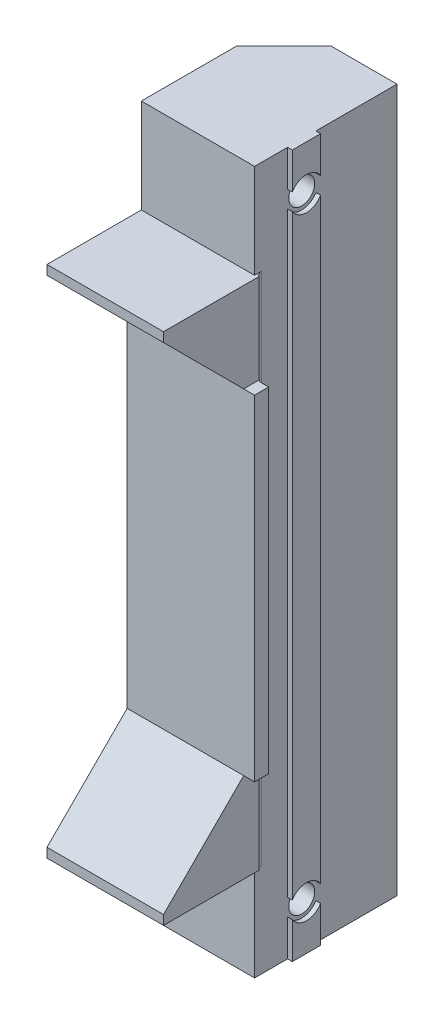
ISO-10303-21;
HEADER;
FILE_DESCRIPTION(('STEP AP214'),'2;1');
FILE_NAME('part.step','',(''),(''),'','','');
FILE_SCHEMA(('AUTOMOTIVE_DESIGN { 1 0 10303 214 1 1 1 1 }'));
ENDSEC;
DATA;
#1=APPLICATION_CONTEXT('core data for automotive mechanical design processes');
#2=APPLICATION_PROTOCOL_DEFINITION('international standard','automotive_design',2000,#1);
#3=PRODUCT_CONTEXT('',#1,'mechanical');
#4=PRODUCT('Part','Part','',(#3));
#5=PRODUCT_RELATED_PRODUCT_CATEGORY('part','',(#4));
#6=PRODUCT_DEFINITION_FORMATION('','',#4);
#7=PRODUCT_DEFINITION_CONTEXT('part definition',#1,'design');
#8=PRODUCT_DEFINITION('design','',#6,#7);
#9=PRODUCT_DEFINITION_SHAPE('','',#8);
#10=(LENGTH_UNIT() NAMED_UNIT(*) SI_UNIT(.MILLI.,.METRE.));
#11=(NAMED_UNIT(*) PLANE_ANGLE_UNIT() SI_UNIT($,.RADIAN.));
#12=(NAMED_UNIT(*) SI_UNIT($,.STERADIAN.) SOLID_ANGLE_UNIT());
#13=UNCERTAINTY_MEASURE_WITH_UNIT(LENGTH_MEASURE(1.E-05),#10,'distance_accuracy_value','');
#14=(GEOMETRIC_REPRESENTATION_CONTEXT(3) GLOBAL_UNCERTAINTY_ASSIGNED_CONTEXT((#13)) GLOBAL_UNIT_ASSIGNED_CONTEXT((#10,
#11,#12)) REPRESENTATION_CONTEXT('',''));
#15=CARTESIAN_POINT('',(0.,0.,0.));
#16=DIRECTION('',(0.,0.,1.));
#17=DIRECTION('',(1.,0.,0.));
#18=AXIS2_PLACEMENT_3D('',#15,#16,#17);
#19=CARTESIAN_POINT('',(-71.75,-84.6006992921502,30.2));
#20=DIRECTION('',(1.,0.,0.));
#21=DIRECTION('',(0.,-1.,0.));
#22=AXIS2_PLACEMENT_3D('',#19,#20,#21);
#23=PLANE('',#22);
#24=DIRECTION('',(0.,1.,0.));
#25=VECTOR('',#24,1.);
#26=CARTESIAN_POINT('',(-71.75,-84.6006992921502,30.2));
#27=LINE('',#26,#25);
#28=CARTESIAN_POINT('',(-71.75,-123.,30.2));
#29=VERTEX_POINT('',#28);
#30=CARTESIAN_POINT('',(-71.75,-52.,30.2));
#31=VERTEX_POINT('',#30);
#32=EDGE_CURVE('E261',#29,#31,#27,.T.);
#33=ORIENTED_EDGE('',*,*,#32,.T.);
#34=DIRECTION('',(0.,0.,1.));
#35=VECTOR('',#34,1.);
#36=CARTESIAN_POINT('',(-71.75,-52.,0.));
#37=LINE('',#36,#35);
#38=CARTESIAN_POINT('',(-71.75,-52.,33.2));
#39=VERTEX_POINT('',#38);
#40=EDGE_CURVE('E256',#31,#39,#37,.T.);
#41=ORIENTED_EDGE('',*,*,#40,.T.);
#42=DIRECTION('',(0.,1.,0.));
#43=VECTOR('',#42,1.);
#44=CARTESIAN_POINT('',(-71.75,-84.6006992921502,33.2));
#45=LINE('',#44,#43);
#46=CARTESIAN_POINT('',(-71.75,-123.,33.2));
#47=VERTEX_POINT('',#46);
#48=EDGE_CURVE('E251',#47,#39,#45,.T.);
#49=ORIENTED_EDGE('',*,*,#48,.F.);
#50=DIRECTION('',(0.,0.,1.));
#51=VECTOR('',#50,1.);
#52=CARTESIAN_POINT('',(-71.75,-123.,0.));
#53=LINE('',#52,#51);
#54=EDGE_CURVE('E255',#29,#47,#53,.T.);
#55=ORIENTED_EDGE('',*,*,#54,.F.);
#56=EDGE_LOOP('',(#33,#41,#49,#55));
#57=FACE_BOUND('',#56,.T.);
#58=ADVANCED_FACE('F46',(#57),#23,.T.);
#59=CARTESIAN_POINT('',(-74.75,-84.6006992921502,30.2));
#60=DIRECTION('',(0.,0.,-1.));
#61=DIRECTION('',(-1.,0.,0.));
#62=AXIS2_PLACEMENT_3D('',#59,#60,#61);
#63=PLANE('',#62);
#64=DIRECTION('',(0.,1.,0.));
#65=VECTOR('',#64,1.);
#66=CARTESIAN_POINT('',(-73.25,-56.,30.2));
#67=LINE('',#66,#65);
#68=CARTESIAN_POINT('',(-73.25,-52.,30.2));
#69=VERTEX_POINT('',#68);
#70=CARTESIAN_POINT('',(-73.25,-123.,30.2));
#71=VERTEX_POINT('',#70);
#72=EDGE_CURVE('E588',#69,#71,#67,.F.);
#73=ORIENTED_EDGE('',*,*,#72,.F.);
#74=DIRECTION('',(1.,0.,0.));
#75=VECTOR('',#74,1.);
#76=CARTESIAN_POINT('',(-74.75,-52.,30.2));
#77=LINE('',#76,#75);
#78=EDGE_CURVE('E459',#69,#31,#77,.T.);
#79=ORIENTED_EDGE('',*,*,#78,.T.);
#80=ORIENTED_EDGE('',*,*,#32,.F.);
#81=DIRECTION('',(1.,0.,0.));
#82=VECTOR('',#81,1.);
#83=CARTESIAN_POINT('',(-74.75,-123.,30.2));
#84=LINE('',#83,#82);
#85=EDGE_CURVE('E277',#71,#29,#84,.T.);
#86=ORIENTED_EDGE('',*,*,#85,.F.);
#87=EDGE_LOOP('',(#73,#79,#80,#86));
#88=FACE_BOUND('',#87,.T.);
#89=ADVANCED_FACE('F689',(#88),#63,.T.);
#90=CARTESIAN_POINT('',(-71.75,-84.6006992921502,33.2));
#91=DIRECTION('',(0.,0.,1.));
#92=DIRECTION('',(1.,0.,0.));
#93=AXIS2_PLACEMENT_3D('',#90,#91,#92);
#94=PLANE('',#93);
#95=ORIENTED_EDGE('',*,*,#48,.T.);
#96=DIRECTION('',(-1.,0.,0.));
#97=VECTOR('',#96,1.);
#98=CARTESIAN_POINT('',(-46.254902432036,-52.,33.2));
#99=LINE('',#98,#97);
#100=CARTESIAN_POINT('',(-74.05,-52.,33.2));
#101=VERTEX_POINT('',#100);
#102=EDGE_CURVE('E490',#39,#101,#99,.T.);
#103=ORIENTED_EDGE('',*,*,#102,.T.);
#104=DIRECTION('',(1.,0.,0.));
#105=VECTOR('',#104,1.);
#106=CARTESIAN_POINT('',(-98.75,-52.,33.2));
#107=LINE('',#106,#105);
#108=CARTESIAN_POINT('',(-98.75,-52.,33.2));
#109=VERTEX_POINT('',#108);
#110=EDGE_CURVE('E487',#109,#101,#107,.T.);
#111=ORIENTED_EDGE('',*,*,#110,.F.);
#112=DIRECTION('',(0.,1.,0.));
#113=VECTOR('',#112,1.);
#114=CARTESIAN_POINT('',(-98.75,-90.673332692431,33.2));
#115=LINE('',#114,#113);
#116=CARTESIAN_POINT('',(-98.75,-123.,33.2));
#117=VERTEX_POINT('',#116);
#118=EDGE_CURVE('E433',#117,#109,#115,.T.);
#119=ORIENTED_EDGE('',*,*,#118,.F.);
#120=DIRECTION('',(1.,0.,0.));
#121=VECTOR('',#120,1.);
#122=CARTESIAN_POINT('',(-98.75,-123.,33.2));
#123=LINE('',#122,#121);
#124=CARTESIAN_POINT('',(-74.05,-123.,33.2));
#125=VERTEX_POINT('',#124);
#126=EDGE_CURVE('E268',#117,#125,#123,.T.);
#127=ORIENTED_EDGE('',*,*,#126,.T.);
#128=DIRECTION('',(-1.,0.,0.));
#129=VECTOR('',#128,1.);
#130=CARTESIAN_POINT('',(-46.254902432036,-123.,33.2));
#131=LINE('',#130,#129);
#132=EDGE_CURVE('E265',#47,#125,#131,.T.);
#133=ORIENTED_EDGE('',*,*,#132,.F.);
#134=EDGE_LOOP('',(#95,#103,#111,#119,#127,#133));
#135=FACE_BOUND('',#134,.T.);
#136=ADVANCED_FACE('F266',(#135),#94,.T.);
#137=CARTESIAN_POINT('',(-73.25,-84.6006992921502,28.7));
#138=DIRECTION('',(0.,-1.,0.));
#139=DIRECTION('',(-1.,0.,0.));
#140=AXIS2_PLACEMENT_3D('',#137,#138,#139);
#141=CYLINDRICAL_SURFACE('',#140,1.5);
#142=CARTESIAN_POINT('',(-73.25,-33.,28.7));
#143=DIRECTION('',(0.,1.,0.));
#144=DIRECTION('',(0.,0.,1.));
#145=AXIS2_PLACEMENT_3D('',#142,#143,#144);
#146=CIRCLE('',#145,1.5);
#147=CARTESIAN_POINT('',(-74.05,-33.,29.968857754045));
#148=VERTEX_POINT('',#147);
#149=CARTESIAN_POINT('',(-74.75,-33.,28.7));
#150=VERTEX_POINT('',#149);
#151=EDGE_CURVE('E595',#148,#150,#146,.F.);
#152=ORIENTED_EDGE('',*,*,#151,.F.);
#153=DIRECTION('',(0.,-1.,0.));
#154=VECTOR('',#153,1.);
#155=CARTESIAN_POINT('',(-74.05,-84.6006992921502,29.968857754045));
#156=LINE('',#155,#154);
#157=CARTESIAN_POINT('',(-74.05,-52.,29.968857754045));
#158=VERTEX_POINT('',#157);
#159=EDGE_CURVE('E440',#148,#158,#156,.T.);
#160=ORIENTED_EDGE('',*,*,#159,.T.);
#161=CARTESIAN_POINT('',(-73.25,-52.,28.7));
#162=DIRECTION('',(0.,1.,0.));
#163=DIRECTION('',(-1.,0.,0.));
#164=AXIS2_PLACEMENT_3D('',#161,#162,#163);
#165=CIRCLE('',#164,1.5);
#166=EDGE_CURVE('E456',#69,#158,#165,.F.);
#167=ORIENTED_EDGE('',*,*,#166,.F.);
#168=ORIENTED_EDGE('',*,*,#72,.T.);
#169=CARTESIAN_POINT('',(-73.25,-123.,28.7));
#170=DIRECTION('',(0.,1.,0.));
#171=DIRECTION('',(-1.,0.,0.));
#172=AXIS2_PLACEMENT_3D('',#169,#170,#171);
#173=CIRCLE('',#172,1.5);
#174=CARTESIAN_POINT('',(-74.05,-123.,29.968857754045));
#175=VERTEX_POINT('',#174);
#176=EDGE_CURVE('E285',#71,#175,#173,.F.);
#177=ORIENTED_EDGE('',*,*,#176,.T.);
#178=DIRECTION('',(0.,1.,0.));
#179=VECTOR('',#178,1.);
#180=CARTESIAN_POINT('',(-74.05,-90.3993007078498,29.968857754045));
#181=LINE('',#180,#179);
#182=CARTESIAN_POINT('',(-74.05,-142.,29.968857754045));
#183=VERTEX_POINT('',#182);
#184=EDGE_CURVE('E279',#183,#175,#181,.T.);
#185=ORIENTED_EDGE('',*,*,#184,.F.);
#186=CARTESIAN_POINT('',(-73.25,-142.,28.7));
#187=DIRECTION('',(0.,1.,0.));
#188=DIRECTION('',(0.,0.,1.));
#189=AXIS2_PLACEMENT_3D('',#186,#187,#188);
#190=CIRCLE('',#189,1.5);
#191=CARTESIAN_POINT('',(-74.75,-142.,28.7));
#192=VERTEX_POINT('',#191);
#193=EDGE_CURVE('E422',#183,#192,#190,.F.);
#194=ORIENTED_EDGE('',*,*,#193,.T.);
#195=DIRECTION('',(0.,1.,0.));
#196=VECTOR('',#195,1.);
#197=CARTESIAN_POINT('',(-74.75,-13.,28.7));
#198=LINE('',#197,#196);
#199=EDGE_CURVE('E584',#192,#150,#198,.T.);
#200=ORIENTED_EDGE('',*,*,#199,.T.);
#201=EDGE_LOOP('',(#152,#160,#167,#168,#177,#185,#194,#200));
#202=FACE_BOUND('',#201,.T.);
#203=ADVANCED_FACE('F684',(#202),#141,.F.);
#204=CARTESIAN_POINT('',(-74.75,-84.6006992921502,23.2));
#205=DIRECTION('',(0.,0.,1.));
#206=DIRECTION('',(1.,0.,0.));
#207=AXIS2_PLACEMENT_3D('',#204,#205,#206);
#208=PLANE('',#207);
#209=DIRECTION('',(-1.,0.,0.));
#210=VECTOR('',#209,1.);
#211=CARTESIAN_POINT('',(84.6494949366116,-24.302775637732,23.2));
#212=LINE('',#211,#210);
#213=CARTESIAN_POINT('',(-73.75,-24.3027756377326,23.2));
#214=VERTEX_POINT('',#213);
#215=CARTESIAN_POINT('',(-74.75,-24.3027756377326,23.2));
#216=VERTEX_POINT('',#215);
#217=EDGE_CURVE('E527',#214,#216,#212,.T.);
#218=ORIENTED_EDGE('',*,*,#217,.T.);
#219=DIRECTION('',(0.,1.,0.));
#220=VECTOR('',#219,1.);
#221=CARTESIAN_POINT('',(-74.75,-84.6006992921502,23.2));
#222=LINE('',#221,#220);
#223=CARTESIAN_POINT('',(-74.75,-150.697224362267,23.2));
#224=VERTEX_POINT('',#223);
#225=EDGE_CURVE('E562',#224,#216,#222,.T.);
#226=ORIENTED_EDGE('',*,*,#225,.F.);
#227=DIRECTION('',(-1.,0.,0.));
#228=VECTOR('',#227,1.);
#229=CARTESIAN_POINT('',(84.6494949366116,-150.697224362268,23.2));
#230=LINE('',#229,#228);
#231=CARTESIAN_POINT('',(-73.75,-150.697224362267,23.2));
#232=VERTEX_POINT('',#231);
#233=EDGE_CURVE('E365',#232,#224,#230,.T.);
#234=ORIENTED_EDGE('',*,*,#233,.F.);
#235=DIRECTION('',(0.,1.,0.));
#236=VECTOR('',#235,1.);
#237=CARTESIAN_POINT('',(-73.75,-84.6006992921502,23.2));
#238=LINE('',#237,#236);
#239=EDGE_CURVE('E566',#232,#214,#238,.T.);
#240=ORIENTED_EDGE('',*,*,#239,.T.);
#241=EDGE_LOOP('',(#218,#226,#234,#240));
#242=FACE_BOUND('',#241,.T.);
#243=ADVANCED_FACE('F731',(#242),#208,.T.);
#244=CARTESIAN_POINT('',(-73.75,-84.6006992921502,17.2));
#245=DIRECTION('',(1.,0.,0.));
#246=DIRECTION('',(0.,-1.,0.));
#247=AXIS2_PLACEMENT_3D('',#244,#245,#246);
#248=PLANE('',#247);
#249=CARTESIAN_POINT('',(-73.75,-22.5,20.2000000000004));
#250=DIRECTION('',(-1.,0.,0.));
#251=DIRECTION('',(0.,-1.,0.));
#252=AXIS2_PLACEMENT_3D('',#249,#250,#251);
#253=CIRCLE('',#252,3.5);
#254=CARTESIAN_POINT('',(-73.75,-20.6972243622674,23.2));
#255=VERTEX_POINT('',#254);
#256=CARTESIAN_POINT('',(-73.75,-20.697224362268,17.2000000000004));
#257=VERTEX_POINT('',#256);
#258=EDGE_CURVE('E528',#255,#257,#253,.T.);
#259=ORIENTED_EDGE('',*,*,#258,.T.);
#260=DIRECTION('',(0.,1.,0.));
#261=VECTOR('',#260,1.);
#262=CARTESIAN_POINT('',(-73.75,-84.6006992921502,17.2));
#263=LINE('',#262,#261);
#264=CARTESIAN_POINT('',(-73.75,-13.,17.2));
#265=VERTEX_POINT('',#264);
#266=EDGE_CURVE('E573',#257,#265,#263,.T.);
#267=ORIENTED_EDGE('',*,*,#266,.T.);
#268=DIRECTION('',(0.,0.,1.));
#269=VECTOR('',#268,1.);
#270=CARTESIAN_POINT('',(-73.75,-13.,17.2));
#271=LINE('',#270,#269);
#272=CARTESIAN_POINT('',(-73.75,-13.,23.2));
#273=VERTEX_POINT('',#272);
#274=EDGE_CURVE('E549',#265,#273,#271,.T.);
#275=ORIENTED_EDGE('',*,*,#274,.T.);
#276=EDGE_CURVE('E569',#255,#273,#238,.T.);
#277=ORIENTED_EDGE('',*,*,#276,.F.);
#278=EDGE_LOOP('',(#259,#267,#275,#277));
#279=FACE_BOUND('',#278,.T.);
#280=ADVANCED_FACE('F736',(#279),#248,.T.);
#281=CARTESIAN_POINT('',(-74.75,-84.6006992921502,17.2));
#282=DIRECTION('',(0.,0.,-1.));
#283=DIRECTION('',(-1.,0.,0.));
#284=AXIS2_PLACEMENT_3D('',#281,#282,#283);
#285=PLANE('',#284);
#286=DIRECTION('',(-1.,0.,0.));
#287=VECTOR('',#286,1.);
#288=CARTESIAN_POINT('',(84.6494949366116,-20.697224362268,17.2));
#289=LINE('',#288,#287);
#290=CARTESIAN_POINT('',(-74.75,-20.6972243622686,17.2));
#291=VERTEX_POINT('',#290);
#292=EDGE_CURVE('E532',#257,#291,#289,.T.);
#293=ORIENTED_EDGE('',*,*,#292,.T.);
#294=DIRECTION('',(0.,1.,0.));
#295=VECTOR('',#294,1.);
#296=CARTESIAN_POINT('',(-74.75,-84.6006992921502,17.2));
#297=LINE('',#296,#295);
#298=CARTESIAN_POINT('',(-74.75,-13.,17.2));
#299=VERTEX_POINT('',#298);
#300=EDGE_CURVE('E558',#291,#299,#297,.T.);
#301=ORIENTED_EDGE('',*,*,#300,.T.);
#302=DIRECTION('',(1.,0.,0.));
#303=VECTOR('',#302,1.);
#304=CARTESIAN_POINT('',(-74.75,-13.,17.2));
#305=LINE('',#304,#303);
#306=EDGE_CURVE('E546',#299,#265,#305,.T.);
#307=ORIENTED_EDGE('',*,*,#306,.T.);
#308=ORIENTED_EDGE('',*,*,#266,.F.);
#309=EDGE_LOOP('',(#293,#301,#307,#308));
#310=FACE_BOUND('',#309,.T.);
#311=ADVANCED_FACE('F741',(#310),#285,.T.);
#312=CARTESIAN_POINT('',(-88.75,-22.5,20.2));
#313=DIRECTION('',(1.,0.,0.));
#314=DIRECTION('',(0.,0.,-1.));
#315=AXIS2_PLACEMENT_3D('',#312,#313,#314);
#316=CYLINDRICAL_SURFACE('',#315,2.75);
#317=CARTESIAN_POINT('',(-83.75,-22.5,20.2));
#318=DIRECTION('',(-1.,0.,0.));
#319=DIRECTION('',(0.,0.,-1.));
#320=AXIS2_PLACEMENT_3D('',#317,#318,#319);
#321=CIRCLE('',#320,2.75);
#322=CARTESIAN_POINT('',(-83.75,-22.5,17.45));
#323=VERTEX_POINT('',#322);
#324=EDGE_CURVE('E591',#323,#323,#321,.F.);
#325=ORIENTED_EDGE('',*,*,#324,.F.);
#326=EDGE_LOOP('',(#325));
#327=FACE_BOUND('',#326,.T.);
#328=CARTESIAN_POINT('',(-74.75,-22.5,20.2));
#329=DIRECTION('',(-1.,0.,0.));
#330=DIRECTION('',(0.,-1.,0.));
#331=AXIS2_PLACEMENT_3D('',#328,#329,#330);
#332=CIRCLE('',#331,2.75);
#333=CARTESIAN_POINT('',(-74.75,-25.25,20.2));
#334=VERTEX_POINT('',#333);
#335=EDGE_CURVE('E523',#334,#334,#332,.F.);
#336=ORIENTED_EDGE('',*,*,#335,.T.);
#337=EDGE_LOOP('',(#336));
#338=FACE_BOUND('',#337,.T.);
#339=ADVANCED_FACE('F748',(#327,#338),#316,.F.);
#340=CARTESIAN_POINT('',(-74.75,-26.,7.2));
#341=DIRECTION('',(-1.,0.,0.));
#342=DIRECTION('',(0.,0.,1.));
#343=AXIS2_PLACEMENT_3D('',#340,#341,#342);
#344=PLANE('',#343);
#345=DIRECTION('',(0.,0.,1.));
#346=VECTOR('',#345,1.);
#347=CARTESIAN_POINT('',(-74.75,-162.,10.2));
#348=LINE('',#347,#346);
#349=CARTESIAN_POINT('',(-74.75,-162.,0.));
#350=VERTEX_POINT('',#349);
#351=CARTESIAN_POINT('',(-74.75,-162.,17.2));
#352=VERTEX_POINT('',#351);
#353=EDGE_CURVE('E381',#350,#352,#348,.T.);
#354=ORIENTED_EDGE('',*,*,#353,.F.);
#355=DIRECTION('',(0.,-1.,0.));
#356=VECTOR('',#355,1.);
#357=CARTESIAN_POINT('',(-74.75,-26.,0.));
#358=LINE('',#357,#356);
#359=CARTESIAN_POINT('',(-74.75,-13.,0.));
#360=VERTEX_POINT('',#359);
#361=EDGE_CURVE('E260',#360,#350,#358,.T.);
#362=ORIENTED_EDGE('',*,*,#361,.F.);
#363=DIRECTION('',(0.,0.,1.));
#364=VECTOR('',#363,1.);
#365=CARTESIAN_POINT('',(-74.75,-13.,10.2));
#366=LINE('',#365,#364);
#367=EDGE_CURVE('E543',#360,#299,#366,.T.);
#368=ORIENTED_EDGE('',*,*,#367,.T.);
#369=ORIENTED_EDGE('',*,*,#300,.F.);
#370=CARTESIAN_POINT('',(-74.75,-22.5,20.2000000000004));
#371=DIRECTION('',(-1.,0.,0.));
#372=DIRECTION('',(0.,-1.,0.));
#373=AXIS2_PLACEMENT_3D('',#370,#371,#372);
#374=CIRCLE('',#373,3.5);
#375=CARTESIAN_POINT('',(-74.75,-20.6972243622674,23.2));
#376=VERTEX_POINT('',#375);
#377=EDGE_CURVE('E517',#376,#291,#374,.T.);
#378=ORIENTED_EDGE('',*,*,#377,.F.);
#379=CARTESIAN_POINT('',(-74.75,-13.,23.2));
#380=VERTEX_POINT('',#379);
#381=EDGE_CURVE('E565',#376,#380,#222,.T.);
#382=ORIENTED_EDGE('',*,*,#381,.T.);
#383=DIRECTION('',(0.,0.,1.));
#384=VECTOR('',#383,1.);
#385=CARTESIAN_POINT('',(-74.75,-13.,23.2));
#386=LINE('',#385,#384);
#387=CARTESIAN_POINT('',(-74.75,-13.,30.2));
#388=VERTEX_POINT('',#387);
#389=EDGE_CURVE('E556',#380,#388,#386,.T.);
#390=ORIENTED_EDGE('',*,*,#389,.T.);
#391=DIRECTION('',(0.,1.,0.));
#392=VECTOR('',#391,1.);
#393=CARTESIAN_POINT('',(-74.75,-33.,30.2));
#394=LINE('',#393,#392);
#395=CARTESIAN_POINT('',(-74.75,-33.,30.2));
#396=VERTEX_POINT('',#395);
#397=EDGE_CURVE('E507',#396,#388,#394,.T.);
#398=ORIENTED_EDGE('',*,*,#397,.F.);
#399=DIRECTION('',(0.,0.,1.));
#400=VECTOR('',#399,1.);
#401=CARTESIAN_POINT('',(-74.75,-33.,30.2));
#402=LINE('',#401,#400);
#403=EDGE_CURVE('E500',#150,#396,#402,.T.);
#404=ORIENTED_EDGE('',*,*,#403,.F.);
#405=ORIENTED_EDGE('',*,*,#199,.F.);
#406=DIRECTION('',(0.,0.,1.));
#407=VECTOR('',#406,1.);
#408=CARTESIAN_POINT('',(-74.75,-142.,30.2));
#409=LINE('',#408,#407);
#410=CARTESIAN_POINT('',(-74.75,-142.,30.2));
#411=VERTEX_POINT('',#410);
#412=EDGE_CURVE('E336',#192,#411,#409,.T.);
#413=ORIENTED_EDGE('',*,*,#412,.T.);
#414=DIRECTION('',(0.,-1.,0.));
#415=VECTOR('',#414,1.);
#416=CARTESIAN_POINT('',(-74.75,-142.,30.2));
#417=LINE('',#416,#415);
#418=CARTESIAN_POINT('',(-74.75,-162.,30.2));
#419=VERTEX_POINT('',#418);
#420=EDGE_CURVE('E344',#411,#419,#417,.T.);
#421=ORIENTED_EDGE('',*,*,#420,.T.);
#422=DIRECTION('',(0.,0.,1.));
#423=VECTOR('',#422,1.);
#424=CARTESIAN_POINT('',(-74.75,-162.,23.2));
#425=LINE('',#424,#423);
#426=CARTESIAN_POINT('',(-74.75,-162.,23.2));
#427=VERTEX_POINT('',#426);
#428=EDGE_CURVE('E394',#427,#419,#425,.T.);
#429=ORIENTED_EDGE('',*,*,#428,.F.);
#430=DIRECTION('',(0.,-1.,0.));
#431=VECTOR('',#430,1.);
#432=CARTESIAN_POINT('',(-74.75,-90.3993007078498,23.2));
#433=LINE('',#432,#431);
#434=CARTESIAN_POINT('',(-74.75,-154.302775637733,23.2));
#435=VERTEX_POINT('',#434);
#436=EDGE_CURVE('E399',#435,#427,#433,.T.);
#437=ORIENTED_EDGE('',*,*,#436,.F.);
#438=CARTESIAN_POINT('',(-74.75,-152.5,20.2000000000004));
#439=DIRECTION('',(1.,0.,0.));
#440=DIRECTION('',(0.,1.,0.));
#441=AXIS2_PLACEMENT_3D('',#438,#439,#440);
#442=CIRCLE('',#441,3.5);
#443=CARTESIAN_POINT('',(-74.75,-154.302775637731,17.2));
#444=VERTEX_POINT('',#443);
#445=EDGE_CURVE('E355',#435,#444,#442,.T.);
#446=ORIENTED_EDGE('',*,*,#445,.T.);
#447=DIRECTION('',(0.,-1.,0.));
#448=VECTOR('',#447,1.);
#449=CARTESIAN_POINT('',(-74.75,-90.3993007078498,17.2));
#450=LINE('',#449,#448);
#451=EDGE_CURVE('E398',#444,#352,#450,.T.);
#452=ORIENTED_EDGE('',*,*,#451,.T.);
#453=EDGE_LOOP('',(#354,#362,#368,#369,#378,#382,#390,#398,#404,#405,#413,#421,#429,#437,#446,#452));
#454=FACE_BOUND('',#453,.T.);
#455=CARTESIAN_POINT('',(-74.75,-150.697224362269,17.2));
#456=VERTEX_POINT('',#455);
#457=CARTESIAN_POINT('',(-74.75,-24.3027756377314,17.2));
#458=VERTEX_POINT('',#457);
#459=EDGE_CURVE('E574',#456,#458,#297,.T.);
#460=ORIENTED_EDGE('',*,*,#459,.F.);
#461=EDGE_CURVE('E351',#456,#224,#442,.T.);
#462=ORIENTED_EDGE('',*,*,#461,.T.);
#463=ORIENTED_EDGE('',*,*,#225,.T.);
#464=EDGE_CURVE('E513',#458,#216,#374,.T.);
#465=ORIENTED_EDGE('',*,*,#464,.F.);
#466=EDGE_LOOP('',(#460,#462,#463,#465));
#467=FACE_BOUND('',#466,.T.);
#468=ORIENTED_EDGE('',*,*,#335,.F.);
#469=EDGE_LOOP('',(#468));
#470=FACE_BOUND('',#469,.T.);
#471=CARTESIAN_POINT('',(-74.75,-152.5,20.2));
#472=DIRECTION('',(1.,0.,0.));
#473=DIRECTION('',(0.,1.,0.));
#474=AXIS2_PLACEMENT_3D('',#471,#472,#473);
#475=CIRCLE('',#474,2.75);
#476=CARTESIAN_POINT('',(-74.75,-149.75,20.2));
#477=VERTEX_POINT('',#476);
#478=EDGE_CURVE('E361',#477,#477,#475,.F.);
#479=ORIENTED_EDGE('',*,*,#478,.T.);
#480=EDGE_LOOP('',(#479));
#481=FACE_BOUND('',#480,.T.);
#482=ADVANCED_FACE('F662',(#454,#467,#470,#481),#344,.F.);
#483=CARTESIAN_POINT('',(-88.75,-13.,7.2));
#484=DIRECTION('',(0.,-1.,0.));
#485=DIRECTION('',(0.,0.,1.));
#486=AXIS2_PLACEMENT_3D('',#483,#484,#485);
#487=PLANE('',#486);
#488=DIRECTION('',(1.,0.,0.));
#489=VECTOR('',#488,1.);
#490=CARTESIAN_POINT('',(-88.75,-13.,0.));
#491=LINE('',#490,#489);
#492=CARTESIAN_POINT('',(-88.7499999999999,-13.,0.));
#493=VERTEX_POINT('',#492);
#494=EDGE_CURVE('E581',#493,#360,#491,.T.);
#495=ORIENTED_EDGE('',*,*,#494,.F.);
#496=DIRECTION('',(0.707106781186549,0.,-0.707106781186546));
#497=VECTOR('',#496,1.);
#498=CARTESIAN_POINT('',(-98.75,-13.,10.));
#499=LINE('',#498,#497);
#500=CARTESIAN_POINT('',(-98.75,-13.,10.));
#501=VERTEX_POINT('',#500);
#502=EDGE_CURVE('E13',#493,#501,#499,.F.);
#503=ORIENTED_EDGE('',*,*,#502,.T.);
#504=DIRECTION('',(0.,0.,-1.));
#505=VECTOR('',#504,1.);
#506=CARTESIAN_POINT('',(-98.75,-13.,0.));
#507=LINE('',#506,#505);
#508=CARTESIAN_POINT('',(-98.75,-13.,30.2));
#509=VERTEX_POINT('',#508);
#510=EDGE_CURVE('E483',#509,#501,#507,.T.);
#511=ORIENTED_EDGE('',*,*,#510,.F.);
#512=DIRECTION('',(-1.,0.,0.));
#513=VECTOR('',#512,1.);
#514=CARTESIAN_POINT('',(-88.75,-13.,30.2));
#515=LINE('',#514,#513);
#516=EDGE_CURVE('E494',#388,#509,#515,.T.);
#517=ORIENTED_EDGE('',*,*,#516,.F.);
#518=ORIENTED_EDGE('',*,*,#389,.F.);
#519=DIRECTION('',(-1.,0.,0.));
#520=VECTOR('',#519,1.);
#521=CARTESIAN_POINT('',(-74.75,-13.,23.2));
#522=LINE('',#521,#520);
#523=EDGE_CURVE('E553',#273,#380,#522,.T.);
#524=ORIENTED_EDGE('',*,*,#523,.F.);
#525=ORIENTED_EDGE('',*,*,#274,.F.);
#526=ORIENTED_EDGE('',*,*,#306,.F.);
#527=ORIENTED_EDGE('',*,*,#367,.F.);
#528=EDGE_LOOP('',(#495,#503,#511,#517,#518,#524,#525,#526,#527));
#529=FACE_BOUND('',#528,.T.);
#530=ADVANCED_FACE('F654',(#529),#487,.F.);
#531=CARTESIAN_POINT('',(0.,-26.,0.));
#532=DIRECTION('',(0.,0.,1.));
#533=DIRECTION('',(1.,0.,0.));
#534=AXIS2_PLACEMENT_3D('',#531,#532,#533);
#535=PLANE('',#534);
#536=ORIENTED_EDGE('',*,*,#361,.T.);
#537=DIRECTION('',(1.,0.,0.));
#538=VECTOR('',#537,1.);
#539=CARTESIAN_POINT('',(-88.75,-162.,0.));
#540=LINE('',#539,#538);
#541=CARTESIAN_POINT('',(-88.7499999999999,-162.,0.));
#542=VERTEX_POINT('',#541);
#543=EDGE_CURVE('E403',#542,#350,#540,.T.);
#544=ORIENTED_EDGE('',*,*,#543,.F.);
#545=DIRECTION('',(0.,1.,0.));
#546=VECTOR('',#545,1.);
#547=CARTESIAN_POINT('',(-88.75,-56.,0.));
#548=LINE('',#547,#546);
#549=EDGE_CURVE('E71',#542,#493,#548,.T.);
#550=ORIENTED_EDGE('',*,*,#549,.T.);
#551=ORIENTED_EDGE('',*,*,#494,.T.);
#552=EDGE_LOOP('',(#536,#544,#550,#551));
#553=FACE_BOUND('',#552,.T.);
#554=ADVANCED_FACE('F659',(#553),#535,.F.);
#555=DIRECTION('',(-1.,0.,0.));
#556=VECTOR('',#555,1.);
#557=CARTESIAN_POINT('',(84.6494949366116,-20.6972243622681,23.2));
#558=LINE('',#557,#556);
#559=EDGE_CURVE('E536',#376,#255,#558,.F.);
#560=ORIENTED_EDGE('',*,*,#559,.T.);
#561=ORIENTED_EDGE('',*,*,#276,.T.);
#562=ORIENTED_EDGE('',*,*,#523,.T.);
#563=ORIENTED_EDGE('',*,*,#381,.F.);
#564=EDGE_LOOP('',(#560,#561,#562,#563));
#565=FACE_BOUND('',#564,.T.);
#566=ADVANCED_FACE('F727',(#565),#208,.T.);
#567=CARTESIAN_POINT('',(-73.75,-24.302775637732,17.2000000000004));
#568=VERTEX_POINT('',#567);
#569=EDGE_CURVE('E522',#568,#214,#253,.T.);
#570=ORIENTED_EDGE('',*,*,#569,.T.);
#571=ORIENTED_EDGE('',*,*,#239,.F.);
#572=CARTESIAN_POINT('',(-73.75,-152.5,20.2000000000004));
#573=DIRECTION('',(1.,0.,0.));
#574=DIRECTION('',(0.,1.,0.));
#575=AXIS2_PLACEMENT_3D('',#572,#573,#574);
#576=CIRCLE('',#575,3.5);
#577=CARTESIAN_POINT('',(-73.75,-150.697224362268,17.2000000000004));
#578=VERTEX_POINT('',#577);
#579=EDGE_CURVE('E360',#578,#232,#576,.T.);
#580=ORIENTED_EDGE('',*,*,#579,.F.);
#581=EDGE_CURVE('E570',#578,#568,#263,.T.);
#582=ORIENTED_EDGE('',*,*,#581,.T.);
#583=EDGE_LOOP('',(#570,#571,#580,#582));
#584=FACE_BOUND('',#583,.T.);
#585=ADVANCED_FACE('F730',(#584),#248,.T.);
#586=DIRECTION('',(-1.,0.,0.));
#587=VECTOR('',#586,1.);
#588=CARTESIAN_POINT('',(84.6494949366116,-24.3027756377321,17.2));
#589=LINE('',#588,#587);
#590=EDGE_CURVE('E518',#458,#568,#589,.F.);
#591=ORIENTED_EDGE('',*,*,#590,.T.);
#592=ORIENTED_EDGE('',*,*,#581,.F.);
#593=DIRECTION('',(-1.,0.,0.));
#594=VECTOR('',#593,1.);
#595=CARTESIAN_POINT('',(84.6494949366116,-150.697224362268,17.2));
#596=LINE('',#595,#594);
#597=EDGE_CURVE('E356',#456,#578,#596,.F.);
#598=ORIENTED_EDGE('',*,*,#597,.F.);
#599=ORIENTED_EDGE('',*,*,#459,.T.);
#600=EDGE_LOOP('',(#591,#592,#598,#599));
#601=FACE_BOUND('',#600,.T.);
#602=ADVANCED_FACE('F734',(#601),#285,.T.);
#603=CARTESIAN_POINT('',(-59.9007575950825,-22.5,20.2));
#604=DIRECTION('',(-1.,0.,0.));
#605=DIRECTION('',(0.,1.,0.));
#606=AXIS2_PLACEMENT_3D('',#603,#604,#605);
#607=CYLINDRICAL_SURFACE('',#606,5.25);
#608=CARTESIAN_POINT('',(-86.25,-22.5,20.2));
#609=DIRECTION('',(-1.,0.,0.));
#610=DIRECTION('',(0.,-1.,0.));
#611=AXIS2_PLACEMENT_3D('',#608,#609,#610);
#612=CIRCLE('',#611,5.25);
#613=CARTESIAN_POINT('',(-86.25,-27.75,20.2));
#614=VERTEX_POINT('',#613);
#615=EDGE_CURVE('E539',#614,#614,#612,.F.);
#616=ORIENTED_EDGE('',*,*,#615,.T.);
#617=EDGE_LOOP('',(#616));
#618=FACE_BOUND('',#617,.T.);
#619=CARTESIAN_POINT('',(-98.75,-22.5,20.2));
#620=DIRECTION('',(-1.,0.,0.));
#621=DIRECTION('',(0.,0.,1.));
#622=AXIS2_PLACEMENT_3D('',#619,#620,#621);
#623=CIRCLE('',#622,5.25);
#624=CARTESIAN_POINT('',(-98.75,-22.5,25.45));
#625=VERTEX_POINT('',#624);
#626=EDGE_CURVE('E463',#625,#625,#623,.T.);
#627=ORIENTED_EDGE('',*,*,#626,.T.);
#628=EDGE_LOOP('',(#627));
#629=FACE_BOUND('',#628,.T.);
#630=ADVANCED_FACE('F739',(#618,#629),#607,.F.);
#631=CARTESIAN_POINT('',(-83.75,-22.5,20.2));
#632=DIRECTION('',(-1.,0.,0.));
#633=DIRECTION('',(0.,0.,1.));
#634=AXIS2_PLACEMENT_3D('',#631,#632,#633);
#635=CONICAL_SURFACE('',#634,2.75,0.785398163397449);
#636=ORIENTED_EDGE('',*,*,#615,.F.);
#637=EDGE_LOOP('',(#636));
#638=FACE_BOUND('',#637,.T.);
#639=ORIENTED_EDGE('',*,*,#324,.T.);
#640=EDGE_LOOP('',(#639));
#641=FACE_BOUND('',#640,.T.);
#642=ADVANCED_FACE('F750',(#638,#641),#635,.F.);
#643=CARTESIAN_POINT('',(84.6494949366116,-22.5,20.2));
#644=DIRECTION('',(-1.,0.,0.));
#645=DIRECTION('',(0.,0.,1.));
#646=AXIS2_PLACEMENT_3D('',#643,#644,#645);
#647=CYLINDRICAL_SURFACE('',#646,3.5);
#648=ORIENTED_EDGE('',*,*,#217,.F.);
#649=ORIENTED_EDGE('',*,*,#569,.F.);
#650=ORIENTED_EDGE('',*,*,#590,.F.);
#651=ORIENTED_EDGE('',*,*,#464,.T.);
#652=EDGE_LOOP('',(#648,#649,#650,#651));
#653=FACE_BOUND('',#652,.T.);
#654=ADVANCED_FACE('F752',(#653),#647,.F.);
#655=ORIENTED_EDGE('',*,*,#559,.F.);
#656=ORIENTED_EDGE('',*,*,#377,.T.);
#657=ORIENTED_EDGE('',*,*,#292,.F.);
#658=ORIENTED_EDGE('',*,*,#258,.F.);
#659=EDGE_LOOP('',(#655,#656,#657,#658));
#660=FACE_BOUND('',#659,.T.);
#661=ADVANCED_FACE('F758',(#660),#647,.F.);
#662=CARTESIAN_POINT('',(-88.75,-33.,30.2));
#663=DIRECTION('',(0.,0.,-1.));
#664=DIRECTION('',(-1.,0.,0.));
#665=AXIS2_PLACEMENT_3D('',#662,#663,#664);
#666=PLANE('',#665);
#667=ORIENTED_EDGE('',*,*,#516,.T.);
#668=DIRECTION('',(0.,1.,0.));
#669=VECTOR('',#668,1.);
#670=CARTESIAN_POINT('',(-98.75,-13.,30.2));
#671=LINE('',#670,#669);
#672=CARTESIAN_POINT('',(-98.75,-33.,30.2));
#673=VERTEX_POINT('',#672);
#674=EDGE_CURVE('E479',#673,#509,#671,.T.);
#675=ORIENTED_EDGE('',*,*,#674,.F.);
#676=DIRECTION('',(-1.,0.,0.));
#677=VECTOR('',#676,1.);
#678=CARTESIAN_POINT('',(-88.75,-33.,30.2));
#679=LINE('',#678,#677);
#680=EDGE_CURVE('E504',#396,#673,#679,.T.);
#681=ORIENTED_EDGE('',*,*,#680,.F.);
#682=ORIENTED_EDGE('',*,*,#397,.T.);
#683=EDGE_LOOP('',(#667,#675,#681,#682));
#684=FACE_BOUND('',#683,.T.);
#685=ADVANCED_FACE('F650',(#684),#666,.F.);
#686=CARTESIAN_POINT('',(0.,-33.,0.));
#687=DIRECTION('',(0.,1.,0.));
#688=DIRECTION('',(0.,0.,1.));
#689=AXIS2_PLACEMENT_3D('',#686,#687,#688);
#690=PLANE('',#689);
#691=DIRECTION('',(0.,0.,1.));
#692=VECTOR('',#691,1.);
#693=CARTESIAN_POINT('',(-74.05,-33.,0.));
#694=LINE('',#693,#692);
#695=CARTESIAN_POINT('',(-74.05,-33.,50.2));
#696=VERTEX_POINT('',#695);
#697=EDGE_CURVE('E63',#148,#696,#694,.T.);
#698=ORIENTED_EDGE('',*,*,#697,.F.);
#699=ORIENTED_EDGE('',*,*,#151,.T.);
#700=ORIENTED_EDGE('',*,*,#403,.T.);
#701=ORIENTED_EDGE('',*,*,#680,.T.);
#702=DIRECTION('',(0.,0.,-1.));
#703=VECTOR('',#702,1.);
#704=CARTESIAN_POINT('',(-98.75,-33.,30.2));
#705=LINE('',#704,#703);
#706=CARTESIAN_POINT('',(-98.75,-33.,50.2));
#707=VERTEX_POINT('',#706);
#708=EDGE_CURVE('E475',#707,#673,#705,.T.);
#709=ORIENTED_EDGE('',*,*,#708,.F.);
#710=DIRECTION('',(-1.,0.,0.));
#711=VECTOR('',#710,1.);
#712=CARTESIAN_POINT('',(-46.254902432036,-33.,50.2));
#713=LINE('',#712,#711);
#714=EDGE_CURVE('E491',#696,#707,#713,.T.);
#715=ORIENTED_EDGE('',*,*,#714,.F.);
#716=EDGE_LOOP('',(#698,#699,#700,#701,#709,#715));
#717=FACE_BOUND('',#716,.T.);
#718=ADVANCED_FACE('F645',(#717),#690,.T.);
#719=CARTESIAN_POINT('',(-46.254902432036,-50.,35.2));
#720=DIRECTION('',(0.,-0.707106781186547,0.707106781186547));
#721=DIRECTION('',(0.,-0.707106781186548,-0.707106781186548));
#722=AXIS2_PLACEMENT_3D('',#719,#720,#721);
#723=PLANE('',#722);
#724=DIRECTION('',(0.,-0.707106781186548,-0.707106781186548));
#725=VECTOR('',#724,1.);
#726=CARTESIAN_POINT('',(-74.05,-42.6,42.6));
#727=LINE('',#726,#725);
#728=CARTESIAN_POINT('',(-74.05,-35.,50.2));
#729=VERTEX_POINT('',#728);
#730=EDGE_CURVE('E441',#729,#101,#727,.T.);
#731=ORIENTED_EDGE('',*,*,#730,.F.);
#732=DIRECTION('',(-1.,0.,0.));
#733=VECTOR('',#732,1.);
#734=CARTESIAN_POINT('',(-46.254902432036,-35.,50.2));
#735=LINE('',#734,#733);
#736=CARTESIAN_POINT('',(-98.75,-35.,50.2));
#737=VERTEX_POINT('',#736);
#738=EDGE_CURVE('E495',#729,#737,#735,.T.);
#739=ORIENTED_EDGE('',*,*,#738,.T.);
#740=DIRECTION('',(0.,0.707106781186548,0.707106781186547));
#741=VECTOR('',#740,1.);
#742=CARTESIAN_POINT('',(-98.75,-35.,50.2));
#743=LINE('',#742,#741);
#744=EDGE_CURVE('E467',#109,#737,#743,.T.);
#745=ORIENTED_EDGE('',*,*,#744,.F.);
#746=ORIENTED_EDGE('',*,*,#110,.T.);
#747=EDGE_LOOP('',(#731,#739,#745,#746));
#748=FACE_BOUND('',#747,.T.);
#749=ADVANCED_FACE('F632',(#748),#723,.T.);
#750=CARTESIAN_POINT('',(-46.254902432036,-35.,50.2));
#751=DIRECTION('',(0.,0.,1.));
#752=DIRECTION('',(1.,0.,0.));
#753=AXIS2_PLACEMENT_3D('',#750,#751,#752);
#754=PLANE('',#753);
#755=DIRECTION('',(0.,-1.,0.));
#756=VECTOR('',#755,1.);
#757=CARTESIAN_POINT('',(-74.05,0.,50.2));
#758=LINE('',#757,#756);
#759=EDGE_CURVE('E448',#696,#729,#758,.T.);
#760=ORIENTED_EDGE('',*,*,#759,.F.);
#761=ORIENTED_EDGE('',*,*,#714,.T.);
#762=DIRECTION('',(0.,1.,0.));
#763=VECTOR('',#762,1.);
#764=CARTESIAN_POINT('',(-98.75,-33.,50.2));
#765=LINE('',#764,#763);
#766=EDGE_CURVE('E471',#737,#707,#765,.T.);
#767=ORIENTED_EDGE('',*,*,#766,.F.);
#768=ORIENTED_EDGE('',*,*,#738,.F.);
#769=EDGE_LOOP('',(#760,#761,#767,#768));
#770=FACE_BOUND('',#769,.T.);
#771=ADVANCED_FACE('F641',(#770),#754,.T.);
#772=CARTESIAN_POINT('',(-98.75,0.,0.));
#773=DIRECTION('',(1.,0.,0.));
#774=DIRECTION('',(0.,0.,-1.));
#775=AXIS2_PLACEMENT_3D('',#772,#773,#774);
#776=PLANE('',#775);
#777=ORIENTED_EDGE('',*,*,#510,.T.);
#778=DIRECTION('',(0.,-1.,0.));
#779=VECTOR('',#778,1.);
#780=CARTESIAN_POINT('',(-98.75,0.,10.));
#781=LINE('',#780,#779);
#782=CARTESIAN_POINT('',(-98.75,-162.,10.));
#783=VERTEX_POINT('',#782);
#784=EDGE_CURVE('E56',#501,#783,#781,.T.);
#785=ORIENTED_EDGE('',*,*,#784,.T.);
#786=DIRECTION('',(0.,0.,-1.));
#787=VECTOR('',#786,1.);
#788=CARTESIAN_POINT('',(-98.75,-162.,0.));
#789=LINE('',#788,#787);
#790=CARTESIAN_POINT('',(-98.75,-162.,30.2));
#791=VERTEX_POINT('',#790);
#792=EDGE_CURVE('E322',#791,#783,#789,.T.);
#793=ORIENTED_EDGE('',*,*,#792,.F.);
#794=DIRECTION('',(0.,-1.,0.));
#795=VECTOR('',#794,1.);
#796=CARTESIAN_POINT('',(-98.75,-162.,30.2));
#797=LINE('',#796,#795);
#798=CARTESIAN_POINT('',(-98.75,-142.,30.2));
#799=VERTEX_POINT('',#798);
#800=EDGE_CURVE('E319',#799,#791,#797,.T.);
#801=ORIENTED_EDGE('',*,*,#800,.F.);
#802=DIRECTION('',(0.,0.,-1.));
#803=VECTOR('',#802,1.);
#804=CARTESIAN_POINT('',(-98.75,-142.,30.2));
#805=LINE('',#804,#803);
#806=CARTESIAN_POINT('',(-98.75,-142.,50.2));
#807=VERTEX_POINT('',#806);
#808=EDGE_CURVE('E316',#807,#799,#805,.T.);
#809=ORIENTED_EDGE('',*,*,#808,.F.);
#810=DIRECTION('',(0.,-1.,0.));
#811=VECTOR('',#810,1.);
#812=CARTESIAN_POINT('',(-98.75,-142.,50.2));
#813=LINE('',#812,#811);
#814=CARTESIAN_POINT('',(-98.75,-140.,50.2));
#815=VERTEX_POINT('',#814);
#816=EDGE_CURVE('E313',#815,#807,#813,.T.);
#817=ORIENTED_EDGE('',*,*,#816,.F.);
#818=DIRECTION('',(0.,-0.707106781186548,0.707106781186547));
#819=VECTOR('',#818,1.);
#820=CARTESIAN_POINT('',(-98.75,-140.,50.2));
#821=LINE('',#820,#819);
#822=EDGE_CURVE('E309',#117,#815,#821,.T.);
#823=ORIENTED_EDGE('',*,*,#822,.F.);
#824=ORIENTED_EDGE('',*,*,#118,.T.);
#825=ORIENTED_EDGE('',*,*,#744,.T.);
#826=ORIENTED_EDGE('',*,*,#766,.T.);
#827=ORIENTED_EDGE('',*,*,#708,.T.);
#828=ORIENTED_EDGE('',*,*,#674,.T.);
#829=EDGE_LOOP('',(#777,#785,#793,#801,#809,#817,#823,#824,#825,#826,#827,#828));
#830=FACE_BOUND('',#829,.T.);
#831=ORIENTED_EDGE('',*,*,#626,.F.);
#832=EDGE_LOOP('',(#831));
#833=FACE_BOUND('',#832,.T.);
#834=CARTESIAN_POINT('',(-98.75,-152.5,20.2));
#835=DIRECTION('',(1.,0.,0.));
#836=DIRECTION('',(0.,0.,1.));
#837=AXIS2_PLACEMENT_3D('',#834,#835,#836);
#838=CIRCLE('',#837,5.25);
#839=CARTESIAN_POINT('',(-98.75,-152.5,25.45));
#840=VERTEX_POINT('',#839);
#841=EDGE_CURVE('E305',#840,#840,#838,.T.);
#842=ORIENTED_EDGE('',*,*,#841,.T.);
#843=EDGE_LOOP('',(#842));
#844=FACE_BOUND('',#843,.T.);
#845=ADVANCED_FACE('F604',(#830,#833,#844),#776,.F.);
#846=CARTESIAN_POINT('',(-98.75,0.,10.));
#847=DIRECTION('',(0.707106781186546,0.,0.707106781186549));
#848=DIRECTION('',(0.,-1.,0.));
#849=AXIS2_PLACEMENT_3D('',#846,#847,#848);
#850=PLANE('',#849);
#851=ORIENTED_EDGE('',*,*,#502,.F.);
#852=ORIENTED_EDGE('',*,*,#549,.F.);
#853=DIRECTION('',(0.707106781186549,0.,-0.707106781186546));
#854=VECTOR('',#853,1.);
#855=CARTESIAN_POINT('',(-98.75,-162.,10.));
#856=LINE('',#855,#854);
#857=EDGE_CURVE('E429',#542,#783,#856,.F.);
#858=ORIENTED_EDGE('',*,*,#857,.T.);
#859=ORIENTED_EDGE('',*,*,#784,.F.);
#860=EDGE_LOOP('',(#851,#852,#858,#859));
#861=FACE_BOUND('',#860,.T.);
#862=ADVANCED_FACE('F49',(#861),#850,.F.);
#863=CARTESIAN_POINT('',(-74.05,-26.,7.2));
#864=DIRECTION('',(-1.,0.,0.));
#865=DIRECTION('',(0.,0.,1.));
#866=AXIS2_PLACEMENT_3D('',#863,#864,#865);
#867=PLANE('',#866);
#868=ORIENTED_EDGE('',*,*,#697,.T.);
#869=ORIENTED_EDGE('',*,*,#759,.T.);
#870=ORIENTED_EDGE('',*,*,#730,.T.);
#871=DIRECTION('',(0.,0.,1.));
#872=VECTOR('',#871,1.);
#873=CARTESIAN_POINT('',(-74.05,-52.,0.));
#874=LINE('',#873,#872);
#875=EDGE_CURVE('E437',#158,#101,#874,.T.);
#876=ORIENTED_EDGE('',*,*,#875,.F.);
#877=ORIENTED_EDGE('',*,*,#159,.F.);
#878=EDGE_LOOP('',(#868,#869,#870,#876,#877));
#879=FACE_BOUND('',#878,.T.);
#880=ADVANCED_FACE('F638',(#879),#867,.F.);
#881=CARTESIAN_POINT('',(-103.442333470807,-52.,0.));
#882=DIRECTION('',(0.,1.,0.));
#883=DIRECTION('',(-1.,0.,0.));
#884=AXIS2_PLACEMENT_3D('',#881,#882,#883);
#885=PLANE('',#884);
#886=ORIENTED_EDGE('',*,*,#166,.T.);
#887=ORIENTED_EDGE('',*,*,#875,.T.);
#888=ORIENTED_EDGE('',*,*,#102,.F.);
#889=ORIENTED_EDGE('',*,*,#40,.F.);
#890=ORIENTED_EDGE('',*,*,#78,.F.);
#891=EDGE_LOOP('',(#886,#887,#888,#889,#890));
#892=FACE_BOUND('',#891,.T.);
#893=ADVANCED_FACE('F636',(#892),#885,.T.);
#894=CARTESIAN_POINT('',(-73.75,-90.3993007078498,17.2));
#895=DIRECTION('',(1.,0.,0.));
#896=DIRECTION('',(0.,1.,0.));
#897=AXIS2_PLACEMENT_3D('',#894,#895,#896);
#898=PLANE('',#897);
#899=CARTESIAN_POINT('',(-73.75,-154.302775637733,23.2));
#900=VERTEX_POINT('',#899);
#901=CARTESIAN_POINT('',(-73.75,-154.302775637732,17.2000000000004));
#902=VERTEX_POINT('',#901);
#903=EDGE_CURVE('E366',#900,#902,#576,.T.);
#904=ORIENTED_EDGE('',*,*,#903,.F.);
#905=DIRECTION('',(0.,-1.,0.));
#906=VECTOR('',#905,1.);
#907=CARTESIAN_POINT('',(-73.75,-90.3993007078498,23.2));
#908=LINE('',#907,#906);
#909=CARTESIAN_POINT('',(-73.75,-162.,23.2));
#910=VERTEX_POINT('',#909);
#911=EDGE_CURVE('E404',#900,#910,#908,.T.);
#912=ORIENTED_EDGE('',*,*,#911,.T.);
#913=DIRECTION('',(0.,0.,1.));
#914=VECTOR('',#913,1.);
#915=CARTESIAN_POINT('',(-73.75,-162.,17.2));
#916=LINE('',#915,#914);
#917=CARTESIAN_POINT('',(-73.75,-162.,17.2));
#918=VERTEX_POINT('',#917);
#919=EDGE_CURVE('E387',#918,#910,#916,.T.);
#920=ORIENTED_EDGE('',*,*,#919,.F.);
#921=DIRECTION('',(0.,-1.,0.));
#922=VECTOR('',#921,1.);
#923=CARTESIAN_POINT('',(-73.75,-90.3993007078498,17.2));
#924=LINE('',#923,#922);
#925=EDGE_CURVE('E408',#902,#918,#924,.T.);
#926=ORIENTED_EDGE('',*,*,#925,.F.);
#927=EDGE_LOOP('',(#904,#912,#920,#926));
#928=FACE_BOUND('',#927,.T.);
#929=ADVANCED_FACE('F674',(#928),#898,.T.);
#930=CARTESIAN_POINT('',(-74.75,-90.3993007078498,17.2));
#931=DIRECTION('',(0.,0.,-1.));
#932=DIRECTION('',(-1.,0.,0.));
#933=AXIS2_PLACEMENT_3D('',#930,#931,#932);
#934=PLANE('',#933);
#935=DIRECTION('',(-1.,0.,0.));
#936=VECTOR('',#935,1.);
#937=CARTESIAN_POINT('',(84.6494949366116,-154.302775637732,17.2));
#938=LINE('',#937,#936);
#939=EDGE_CURVE('E370',#902,#444,#938,.T.);
#940=ORIENTED_EDGE('',*,*,#939,.F.);
#941=ORIENTED_EDGE('',*,*,#925,.T.);
#942=DIRECTION('',(1.,0.,0.));
#943=VECTOR('',#942,1.);
#944=CARTESIAN_POINT('',(-74.75,-162.,17.2));
#945=LINE('',#944,#943);
#946=EDGE_CURVE('E384',#352,#918,#945,.T.);
#947=ORIENTED_EDGE('',*,*,#946,.F.);
#948=ORIENTED_EDGE('',*,*,#451,.F.);
#949=EDGE_LOOP('',(#940,#941,#947,#948));
#950=FACE_BOUND('',#949,.T.);
#951=ADVANCED_FACE('F670',(#950),#934,.T.);
#952=CARTESIAN_POINT('',(-88.75,-152.5,20.2));
#953=DIRECTION('',(1.,0.,0.));
#954=DIRECTION('',(0.,0.,-1.));
#955=AXIS2_PLACEMENT_3D('',#952,#953,#954);
#956=CYLINDRICAL_SURFACE('',#955,2.75);
#957=CARTESIAN_POINT('',(-83.75,-152.5,20.2));
#958=DIRECTION('',(1.,0.,0.));
#959=DIRECTION('',(0.,0.,-1.));
#960=AXIS2_PLACEMENT_3D('',#957,#958,#959);
#961=CIRCLE('',#960,2.75);
#962=CARTESIAN_POINT('',(-83.75,-152.5,17.45));
#963=VERTEX_POINT('',#962);
#964=EDGE_CURVE('E418',#963,#963,#961,.F.);
#965=ORIENTED_EDGE('',*,*,#964,.T.);
#966=EDGE_LOOP('',(#965));
#967=FACE_BOUND('',#966,.T.);
#968=ORIENTED_EDGE('',*,*,#478,.F.);
#969=EDGE_LOOP('',(#968));
#970=FACE_BOUND('',#969,.T.);
#971=ADVANCED_FACE('F774',(#967,#970),#956,.F.);
#972=CARTESIAN_POINT('',(-88.75,-162.,7.2));
#973=DIRECTION('',(0.,1.,0.));
#974=DIRECTION('',(0.,0.,1.));
#975=AXIS2_PLACEMENT_3D('',#972,#973,#974);
#976=PLANE('',#975);
#977=ORIENTED_EDGE('',*,*,#543,.T.);
#978=ORIENTED_EDGE('',*,*,#353,.T.);
#979=ORIENTED_EDGE('',*,*,#946,.T.);
#980=ORIENTED_EDGE('',*,*,#919,.T.);
#981=DIRECTION('',(-1.,0.,0.));
#982=VECTOR('',#981,1.);
#983=CARTESIAN_POINT('',(-74.75,-162.,23.2));
#984=LINE('',#983,#982);
#985=EDGE_CURVE('E391',#910,#427,#984,.T.);
#986=ORIENTED_EDGE('',*,*,#985,.T.);
#987=ORIENTED_EDGE('',*,*,#428,.T.);
#988=DIRECTION('',(-1.,0.,0.));
#989=VECTOR('',#988,1.);
#990=CARTESIAN_POINT('',(-88.75,-162.,30.2));
#991=LINE('',#990,#989);
#992=EDGE_CURVE('E332',#419,#791,#991,.T.);
#993=ORIENTED_EDGE('',*,*,#992,.T.);
#994=ORIENTED_EDGE('',*,*,#792,.T.);
#995=ORIENTED_EDGE('',*,*,#857,.F.);
#996=EDGE_LOOP('',(#977,#978,#979,#980,#986,#987,#993,#994,#995));
#997=FACE_BOUND('',#996,.T.);
#998=ADVANCED_FACE('F612',(#997),#976,.F.);
#999=CARTESIAN_POINT('',(-74.75,-90.3993007078498,23.2));
#1000=DIRECTION('',(0.,0.,1.));
#1001=DIRECTION('',(1.,0.,0.));
#1002=AXIS2_PLACEMENT_3D('',#999,#1000,#1001);
#1003=PLANE('',#1002);
#1004=DIRECTION('',(-1.,0.,0.));
#1005=VECTOR('',#1004,1.);
#1006=CARTESIAN_POINT('',(84.6494949366116,-154.302775637732,23.2));
#1007=LINE('',#1006,#1005);
#1008=EDGE_CURVE('E374',#435,#900,#1007,.F.);
#1009=ORIENTED_EDGE('',*,*,#1008,.F.);
#1010=ORIENTED_EDGE('',*,*,#436,.T.);
#1011=ORIENTED_EDGE('',*,*,#985,.F.);
#1012=ORIENTED_EDGE('',*,*,#911,.F.);
#1013=EDGE_LOOP('',(#1009,#1010,#1011,#1012));
#1014=FACE_BOUND('',#1013,.T.);
#1015=ADVANCED_FACE('F677',(#1014),#1003,.T.);
#1016=CARTESIAN_POINT('',(-59.9007575950825,-152.5,20.2));
#1017=DIRECTION('',(-1.,0.,0.));
#1018=DIRECTION('',(0.,-1.,0.));
#1019=AXIS2_PLACEMENT_3D('',#1016,#1017,#1018);
#1020=CYLINDRICAL_SURFACE('',#1019,5.25);
#1021=CARTESIAN_POINT('',(-86.25,-152.5,20.2));
#1022=DIRECTION('',(1.,0.,0.));
#1023=DIRECTION('',(0.,1.,0.));
#1024=AXIS2_PLACEMENT_3D('',#1021,#1022,#1023);
#1025=CIRCLE('',#1024,5.25);
#1026=CARTESIAN_POINT('',(-86.25,-147.25,20.2));
#1027=VERTEX_POINT('',#1026);
#1028=EDGE_CURVE('E377',#1027,#1027,#1025,.F.);
#1029=ORIENTED_EDGE('',*,*,#1028,.F.);
#1030=EDGE_LOOP('',(#1029));
#1031=FACE_BOUND('',#1030,.T.);
#1032=ORIENTED_EDGE('',*,*,#841,.F.);
#1033=EDGE_LOOP('',(#1032));
#1034=FACE_BOUND('',#1033,.T.);
#1035=ADVANCED_FACE('F785',(#1031,#1034),#1020,.F.);
#1036=CARTESIAN_POINT('',(-83.75,-152.5,20.2));
#1037=DIRECTION('',(-1.,0.,0.));
#1038=DIRECTION('',(0.,0.,1.));
#1039=AXIS2_PLACEMENT_3D('',#1036,#1037,#1038);
#1040=CONICAL_SURFACE('',#1039,2.75,0.785398163397449);
#1041=ORIENTED_EDGE('',*,*,#1028,.T.);
#1042=EDGE_LOOP('',(#1041));
#1043=FACE_BOUND('',#1042,.T.);
#1044=ORIENTED_EDGE('',*,*,#964,.F.);
#1045=EDGE_LOOP('',(#1044));
#1046=FACE_BOUND('',#1045,.T.);
#1047=ADVANCED_FACE('F715',(#1043,#1046),#1040,.F.);
#1048=CARTESIAN_POINT('',(84.6494949366116,-152.5,20.2));
#1049=DIRECTION('',(-1.,0.,0.));
#1050=DIRECTION('',(0.,0.,1.));
#1051=AXIS2_PLACEMENT_3D('',#1048,#1049,#1050);
#1052=CYLINDRICAL_SURFACE('',#1051,3.5);
#1053=ORIENTED_EDGE('',*,*,#233,.T.);
#1054=ORIENTED_EDGE('',*,*,#461,.F.);
#1055=ORIENTED_EDGE('',*,*,#597,.T.);
#1056=ORIENTED_EDGE('',*,*,#579,.T.);
#1057=EDGE_LOOP('',(#1053,#1054,#1055,#1056));
#1058=FACE_BOUND('',#1057,.T.);
#1059=ADVANCED_FACE('F708',(#1058),#1052,.F.);
#1060=ORIENTED_EDGE('',*,*,#1008,.T.);
#1061=ORIENTED_EDGE('',*,*,#903,.T.);
#1062=ORIENTED_EDGE('',*,*,#939,.T.);
#1063=ORIENTED_EDGE('',*,*,#445,.F.);
#1064=EDGE_LOOP('',(#1060,#1061,#1062,#1063));
#1065=FACE_BOUND('',#1064,.T.);
#1066=ADVANCED_FACE('F706',(#1065),#1052,.F.);
#1067=CARTESIAN_POINT('',(-88.75,-142.,30.2));
#1068=DIRECTION('',(0.,0.,-1.));
#1069=DIRECTION('',(-1.,0.,0.));
#1070=AXIS2_PLACEMENT_3D('',#1067,#1068,#1069);
#1071=PLANE('',#1070);
#1072=ORIENTED_EDGE('',*,*,#992,.F.);
#1073=ORIENTED_EDGE('',*,*,#420,.F.);
#1074=DIRECTION('',(-1.,0.,0.));
#1075=VECTOR('',#1074,1.);
#1076=CARTESIAN_POINT('',(-88.75,-142.,30.2));
#1077=LINE('',#1076,#1075);
#1078=EDGE_CURVE('E340',#411,#799,#1077,.T.);
#1079=ORIENTED_EDGE('',*,*,#1078,.T.);
#1080=ORIENTED_EDGE('',*,*,#800,.T.);
#1081=EDGE_LOOP('',(#1072,#1073,#1079,#1080));
#1082=FACE_BOUND('',#1081,.T.);
#1083=ADVANCED_FACE('F616',(#1082),#1071,.F.);
#1084=CARTESIAN_POINT('',(0.,-142.,0.));
#1085=DIRECTION('',(0.,-1.,0.));
#1086=DIRECTION('',(0.,0.,1.));
#1087=AXIS2_PLACEMENT_3D('',#1084,#1085,#1086);
#1088=PLANE('',#1087);
#1089=DIRECTION('',(0.,0.,1.));
#1090=VECTOR('',#1089,1.);
#1091=CARTESIAN_POINT('',(-74.05,-142.,0.));
#1092=LINE('',#1091,#1090);
#1093=CARTESIAN_POINT('',(-74.05,-142.,50.2));
#1094=VERTEX_POINT('',#1093);
#1095=EDGE_CURVE('E293',#183,#1094,#1092,.T.);
#1096=ORIENTED_EDGE('',*,*,#1095,.T.);
#1097=DIRECTION('',(-1.,0.,0.));
#1098=VECTOR('',#1097,1.);
#1099=CARTESIAN_POINT('',(-46.254902432036,-142.,50.2));
#1100=LINE('',#1099,#1098);
#1101=EDGE_CURVE('E328',#1094,#807,#1100,.T.);
#1102=ORIENTED_EDGE('',*,*,#1101,.T.);
#1103=ORIENTED_EDGE('',*,*,#808,.T.);
#1104=ORIENTED_EDGE('',*,*,#1078,.F.);
#1105=ORIENTED_EDGE('',*,*,#412,.F.);
#1106=ORIENTED_EDGE('',*,*,#193,.F.);
#1107=EDGE_LOOP('',(#1096,#1102,#1103,#1104,#1105,#1106));
#1108=FACE_BOUND('',#1107,.T.);
#1109=ADVANCED_FACE('F621',(#1108),#1088,.T.);
#1110=CARTESIAN_POINT('',(-46.254902432036,-125.,35.2));
#1111=DIRECTION('',(0.,0.707106781186547,0.707106781186547));
#1112=DIRECTION('',(0.,0.707106781186548,-0.707106781186548));
#1113=AXIS2_PLACEMENT_3D('',#1110,#1111,#1112);
#1114=PLANE('',#1113);
#1115=DIRECTION('',(0.,0.707106781186548,-0.707106781186548));
#1116=VECTOR('',#1115,1.);
#1117=CARTESIAN_POINT('',(-74.05,-132.4,42.6));
#1118=LINE('',#1117,#1116);
#1119=CARTESIAN_POINT('',(-74.05,-140.,50.2));
#1120=VERTEX_POINT('',#1119);
#1121=EDGE_CURVE('E280',#1120,#125,#1118,.T.);
#1122=ORIENTED_EDGE('',*,*,#1121,.T.);
#1123=ORIENTED_EDGE('',*,*,#126,.F.);
#1124=ORIENTED_EDGE('',*,*,#822,.T.);
#1125=DIRECTION('',(-1.,0.,0.));
#1126=VECTOR('',#1125,1.);
#1127=CARTESIAN_POINT('',(-46.254902432036,-140.,50.2));
#1128=LINE('',#1127,#1126);
#1129=EDGE_CURVE('E271',#1120,#815,#1128,.T.);
#1130=ORIENTED_EDGE('',*,*,#1129,.F.);
#1131=EDGE_LOOP('',(#1122,#1123,#1124,#1130));
#1132=FACE_BOUND('',#1131,.T.);
#1133=ADVANCED_FACE('F628',(#1132),#1114,.T.);
#1134=CARTESIAN_POINT('',(-46.254902432036,-140.,50.2));
#1135=DIRECTION('',(0.,0.,1.));
#1136=DIRECTION('',(1.,0.,0.));
#1137=AXIS2_PLACEMENT_3D('',#1134,#1135,#1136);
#1138=PLANE('',#1137);
#1139=DIRECTION('',(0.,1.,0.));
#1140=VECTOR('',#1139,1.);
#1141=CARTESIAN_POINT('',(-74.05,-175.,50.2));
#1142=LINE('',#1141,#1140);
#1143=EDGE_CURVE('E288',#1094,#1120,#1142,.T.);
#1144=ORIENTED_EDGE('',*,*,#1143,.T.);
#1145=ORIENTED_EDGE('',*,*,#1129,.T.);
#1146=ORIENTED_EDGE('',*,*,#816,.T.);
#1147=ORIENTED_EDGE('',*,*,#1101,.F.);
#1148=EDGE_LOOP('',(#1144,#1145,#1146,#1147));
#1149=FACE_BOUND('',#1148,.T.);
#1150=ADVANCED_FACE('F624',(#1149),#1138,.T.);
#1151=CARTESIAN_POINT('',(-74.05,-149.,7.2));
#1152=DIRECTION('',(-1.,0.,0.));
#1153=DIRECTION('',(0.,0.,1.));
#1154=AXIS2_PLACEMENT_3D('',#1151,#1152,#1153);
#1155=PLANE('',#1154);
#1156=ORIENTED_EDGE('',*,*,#1095,.F.);
#1157=ORIENTED_EDGE('',*,*,#184,.T.);
#1158=DIRECTION('',(0.,0.,1.));
#1159=VECTOR('',#1158,1.);
#1160=CARTESIAN_POINT('',(-74.05,-123.,0.));
#1161=LINE('',#1160,#1159);
#1162=EDGE_CURVE('E291',#175,#125,#1161,.T.);
#1163=ORIENTED_EDGE('',*,*,#1162,.T.);
#1164=ORIENTED_EDGE('',*,*,#1121,.F.);
#1165=ORIENTED_EDGE('',*,*,#1143,.F.);
#1166=EDGE_LOOP('',(#1156,#1157,#1163,#1164,#1165));
#1167=FACE_BOUND('',#1166,.T.);
#1168=ADVANCED_FACE('F686',(#1167),#1155,.F.);
#1169=CARTESIAN_POINT('',(-103.442333470807,-123.,0.));
#1170=DIRECTION('',(0.,-1.,0.));
#1171=DIRECTION('',(-1.,0.,0.));
#1172=AXIS2_PLACEMENT_3D('',#1169,#1170,#1171);
#1173=PLANE('',#1172);
#1174=ORIENTED_EDGE('',*,*,#176,.F.);
#1175=ORIENTED_EDGE('',*,*,#85,.T.);
#1176=ORIENTED_EDGE('',*,*,#54,.T.);
#1177=ORIENTED_EDGE('',*,*,#132,.T.);
#1178=ORIENTED_EDGE('',*,*,#1162,.F.);
#1179=EDGE_LOOP('',(#1174,#1175,#1176,#1177,#1178));
#1180=FACE_BOUND('',#1179,.T.);
#1181=ADVANCED_FACE('F275',(#1180),#1173,.T.);
#1182=CLOSED_SHELL('',(#58,#89,#136,#203,#243,#280,#311,#339,#482,#530,#554,#566,#585,#602,#630,
#642,#654,#661,#685,#718,#749,#771,#845,#862,#880,#893,#929,#951,#971,#998,#1015,#1035,#1047,
#1059,#1066,#1083,#1109,#1133,#1150,#1168,#1181));
#1183=MANIFOLD_SOLID_BREP('B2',#1182);
#1184=ADVANCED_BREP_SHAPE_REPRESENTATION('',(#18,#1183),#14);
#1185=SHAPE_DEFINITION_REPRESENTATION(#9,#1184);
ENDSEC;
END-ISO-10303-21;
